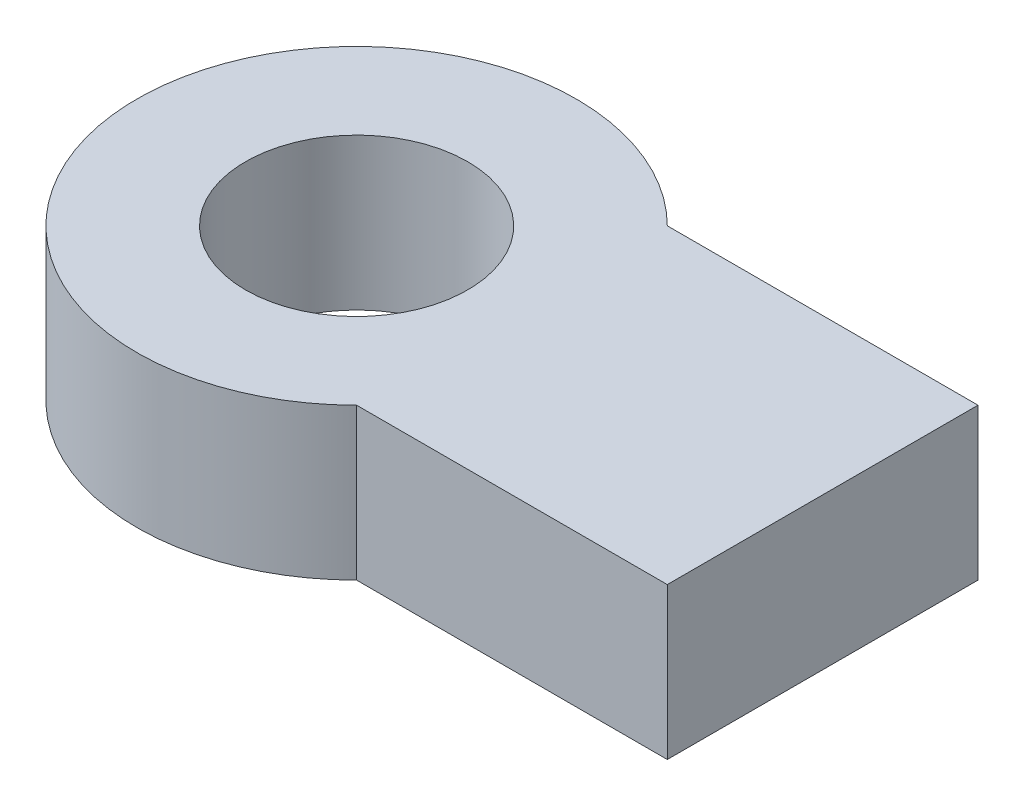
ISO-10303-21;
HEADER;
FILE_DESCRIPTION(('STEP AP214'),'2;1');
FILE_NAME('part.step','',(''),(''),'','','');
FILE_SCHEMA(('AUTOMOTIVE_DESIGN { 1 0 10303 214 1 1 1 1 }'));
ENDSEC;
DATA;
#1=APPLICATION_CONTEXT('core data for automotive mechanical design processes');
#2=APPLICATION_PROTOCOL_DEFINITION('international standard','automotive_design',2000,#1);
#3=PRODUCT_CONTEXT('',#1,'mechanical');
#4=PRODUCT('Part','Part','',(#3));
#5=PRODUCT_RELATED_PRODUCT_CATEGORY('part','',(#4));
#6=PRODUCT_DEFINITION_FORMATION('','',#4);
#7=PRODUCT_DEFINITION_CONTEXT('part definition',#1,'design');
#8=PRODUCT_DEFINITION('design','',#6,#7);
#9=PRODUCT_DEFINITION_SHAPE('','',#8);
#10=(LENGTH_UNIT() NAMED_UNIT(*) SI_UNIT(.MILLI.,.METRE.));
#11=(NAMED_UNIT(*) PLANE_ANGLE_UNIT() SI_UNIT($,.RADIAN.));
#12=(NAMED_UNIT(*) SI_UNIT($,.STERADIAN.) SOLID_ANGLE_UNIT());
#13=UNCERTAINTY_MEASURE_WITH_UNIT(LENGTH_MEASURE(1.E-05),#10,'distance_accuracy_value','');
#14=(GEOMETRIC_REPRESENTATION_CONTEXT(3) GLOBAL_UNCERTAINTY_ASSIGNED_CONTEXT((#13)) GLOBAL_UNIT_ASSIGNED_CONTEXT((#10,
#11,#12)) REPRESENTATION_CONTEXT('',''));
#15=CARTESIAN_POINT('',(0.,0.,0.));
#16=DIRECTION('',(0.,0.,1.));
#17=DIRECTION('',(1.,0.,0.));
#18=AXIS2_PLACEMENT_3D('',#15,#16,#17);
#19=CARTESIAN_POINT('',(0.,1.5,0.));
#20=DIRECTION('',(0.,1.,0.));
#21=DIRECTION('',(0.,0.,1.));
#22=AXIS2_PLACEMENT_3D('',#19,#20,#21);
#23=PLANE('',#22);
#24=CARTESIAN_POINT('',(0.,1.5,0.));
#25=DIRECTION('',(0.,1.,0.));
#26=DIRECTION('',(0.,0.,1.));
#27=AXIS2_PLACEMENT_3D('',#24,#25,#26);
#28=CIRCLE('',#27,2.175);
#29=CARTESIAN_POINT('',(1.53795724908074,1.5,-1.53795724908074));
#30=VERTEX_POINT('',#29);
#31=CARTESIAN_POINT('',(1.53795724908074,1.5,1.53795724908074));
#32=VERTEX_POINT('',#31);
#33=EDGE_CURVE('E92',#30,#32,#28,.T.);
#34=ORIENTED_EDGE('',*,*,#33,.T.);
#35=DIRECTION('',(1.,0.,0.));
#36=VECTOR('',#35,1.);
#37=CARTESIAN_POINT('',(1.53795724908074,1.5,1.53795724908074));
#38=LINE('',#37,#36);
#39=CARTESIAN_POINT('',(4.61387174724222,1.5,1.53795724908074));
#40=VERTEX_POINT('',#39);
#41=EDGE_CURVE('E87',#32,#40,#38,.T.);
#42=ORIENTED_EDGE('',*,*,#41,.T.);
#43=DIRECTION('',(0.,0.,-1.));
#44=VECTOR('',#43,1.);
#45=CARTESIAN_POINT('',(4.61387174724222,1.5,-1.53795724908074));
#46=LINE('',#45,#44);
#47=CARTESIAN_POINT('',(4.61387174724222,1.5,-1.53795724908074));
#48=VERTEX_POINT('',#47);
#49=EDGE_CURVE('E90',#40,#48,#46,.T.);
#50=ORIENTED_EDGE('',*,*,#49,.T.);
#51=DIRECTION('',(-1.,0.,0.));
#52=VECTOR('',#51,1.);
#53=CARTESIAN_POINT('',(1.53795724908074,1.5,-1.53795724908074));
#54=LINE('',#53,#52);
#55=EDGE_CURVE('E57',#48,#30,#54,.T.);
#56=ORIENTED_EDGE('',*,*,#55,.T.);
#57=EDGE_LOOP('',(#34,#42,#50,#56));
#58=FACE_BOUND('',#57,.T.);
#59=CARTESIAN_POINT('',(0.,1.5,0.));
#60=DIRECTION('',(0.,1.,0.));
#61=DIRECTION('',(0.,0.,1.));
#62=AXIS2_PLACEMENT_3D('',#59,#60,#61);
#63=CIRCLE('',#62,1.1);
#64=CARTESIAN_POINT('',(0.,1.5,1.1));
#65=VERTEX_POINT('',#64);
#66=EDGE_CURVE('E112',#65,#65,#63,.T.);
#67=ORIENTED_EDGE('',*,*,#66,.F.);
#68=EDGE_LOOP('',(#67));
#69=FACE_BOUND('',#68,.T.);
#70=ADVANCED_FACE('F39',(#58,#69),#23,.T.);
#71=CARTESIAN_POINT('',(0.,0.,0.));
#72=DIRECTION('',(0.,1.,0.));
#73=DIRECTION('',(0.,0.,1.));
#74=AXIS2_PLACEMENT_3D('',#71,#72,#73);
#75=PLANE('',#74);
#76=CARTESIAN_POINT('',(0.,0.,0.));
#77=DIRECTION('',(0.,1.,0.));
#78=DIRECTION('',(0.,0.,1.));
#79=AXIS2_PLACEMENT_3D('',#76,#77,#78);
#80=CIRCLE('',#79,2.175);
#81=CARTESIAN_POINT('',(1.53795724908074,0.,-1.53795724908074));
#82=VERTEX_POINT('',#81);
#83=CARTESIAN_POINT('',(1.53795724908074,0.,1.53795724908074));
#84=VERTEX_POINT('',#83);
#85=EDGE_CURVE('E108',#82,#84,#80,.T.);
#86=ORIENTED_EDGE('',*,*,#85,.F.);
#87=DIRECTION('',(-1.,0.,0.));
#88=VECTOR('',#87,1.);
#89=CARTESIAN_POINT('',(1.53795724908074,0.,-1.53795724908074));
#90=LINE('',#89,#88);
#91=CARTESIAN_POINT('',(4.61387174724222,0.,-1.53795724908074));
#92=VERTEX_POINT('',#91);
#93=EDGE_CURVE('E80',#92,#82,#90,.T.);
#94=ORIENTED_EDGE('',*,*,#93,.F.);
#95=DIRECTION('',(0.,0.,-1.));
#96=VECTOR('',#95,1.);
#97=CARTESIAN_POINT('',(4.61387174724222,0.,-1.53795724908074));
#98=LINE('',#97,#96);
#99=CARTESIAN_POINT('',(4.61387174724222,0.,1.53795724908074));
#100=VERTEX_POINT('',#99);
#101=EDGE_CURVE('E74',#100,#92,#98,.T.);
#102=ORIENTED_EDGE('',*,*,#101,.F.);
#103=DIRECTION('',(1.,0.,0.));
#104=VECTOR('',#103,1.);
#105=CARTESIAN_POINT('',(1.53795724908074,0.,1.53795724908074));
#106=LINE('',#105,#104);
#107=EDGE_CURVE('E97',#84,#100,#106,.T.);
#108=ORIENTED_EDGE('',*,*,#107,.F.);
#109=EDGE_LOOP('',(#86,#94,#102,#108));
#110=FACE_BOUND('',#109,.T.);
#111=CARTESIAN_POINT('',(0.,0.,0.));
#112=DIRECTION('',(0.,1.,0.));
#113=DIRECTION('',(0.,0.,1.));
#114=AXIS2_PLACEMENT_3D('',#111,#112,#113);
#115=CIRCLE('',#114,1.1);
#116=CARTESIAN_POINT('',(0.,0.,1.1));
#117=VERTEX_POINT('',#116);
#118=EDGE_CURVE('E130',#117,#117,#115,.T.);
#119=ORIENTED_EDGE('',*,*,#118,.T.);
#120=EDGE_LOOP('',(#119));
#121=FACE_BOUND('',#120,.T.);
#122=ADVANCED_FACE('F125',(#110,#121),#75,.F.);
#123=CARTESIAN_POINT('',(0.,1.5,0.));
#124=DIRECTION('',(0.,-1.,0.));
#125=DIRECTION('',(0.,0.,-1.));
#126=AXIS2_PLACEMENT_3D('',#123,#124,#125);
#127=CYLINDRICAL_SURFACE('',#126,2.175);
#128=ORIENTED_EDGE('',*,*,#85,.T.);
#129=DIRECTION('',(0.,-1.,0.));
#130=VECTOR('',#129,1.);
#131=CARTESIAN_POINT('',(1.53795724908074,1.5,1.53795724908074));
#132=LINE('',#131,#130);
#133=EDGE_CURVE('E11',#32,#84,#132,.T.);
#134=ORIENTED_EDGE('',*,*,#133,.F.);
#135=ORIENTED_EDGE('',*,*,#33,.F.);
#136=DIRECTION('',(0.,-1.,0.));
#137=VECTOR('',#136,1.);
#138=CARTESIAN_POINT('',(1.53795724908074,1.5,-1.53795724908074));
#139=LINE('',#138,#137);
#140=EDGE_CURVE('E104',#30,#82,#139,.T.);
#141=ORIENTED_EDGE('',*,*,#140,.T.);
#142=EDGE_LOOP('',(#128,#134,#135,#141));
#143=FACE_BOUND('',#142,.T.);
#144=ADVANCED_FACE('F41',(#143),#127,.T.);
#145=CARTESIAN_POINT('',(1.53795724908074,1.5,1.53795724908074));
#146=DIRECTION('',(0.,0.,-1.));
#147=DIRECTION('',(-1.,0.,0.));
#148=AXIS2_PLACEMENT_3D('',#145,#146,#147);
#149=PLANE('',#148);
#150=ORIENTED_EDGE('',*,*,#107,.T.);
#151=DIRECTION('',(0.,-1.,0.));
#152=VECTOR('',#151,1.);
#153=CARTESIAN_POINT('',(4.61387174724222,1.5,1.53795724908074));
#154=LINE('',#153,#152);
#155=EDGE_CURVE('E49',#40,#100,#154,.T.);
#156=ORIENTED_EDGE('',*,*,#155,.F.);
#157=ORIENTED_EDGE('',*,*,#41,.F.);
#158=ORIENTED_EDGE('',*,*,#133,.T.);
#159=EDGE_LOOP('',(#150,#156,#157,#158));
#160=FACE_BOUND('',#159,.T.);
#161=ADVANCED_FACE('F96',(#160),#149,.F.);
#162=CARTESIAN_POINT('',(4.61387174724222,1.5,-1.53795724908074));
#163=DIRECTION('',(-1.,0.,0.));
#164=DIRECTION('',(0.,0.,1.));
#165=AXIS2_PLACEMENT_3D('',#162,#163,#164);
#166=PLANE('',#165);
#167=ORIENTED_EDGE('',*,*,#101,.T.);
#168=DIRECTION('',(0.,-1.,0.));
#169=VECTOR('',#168,1.);
#170=CARTESIAN_POINT('',(4.61387174724222,1.5,-1.53795724908074));
#171=LINE('',#170,#169);
#172=EDGE_CURVE('E99',#48,#92,#171,.T.);
#173=ORIENTED_EDGE('',*,*,#172,.F.);
#174=ORIENTED_EDGE('',*,*,#49,.F.);
#175=ORIENTED_EDGE('',*,*,#155,.T.);
#176=EDGE_LOOP('',(#167,#173,#174,#175));
#177=FACE_BOUND('',#176,.T.);
#178=ADVANCED_FACE('F100',(#177),#166,.F.);
#179=CARTESIAN_POINT('',(1.53795724908074,1.5,-1.53795724908074));
#180=DIRECTION('',(0.,0.,1.));
#181=DIRECTION('',(1.,0.,0.));
#182=AXIS2_PLACEMENT_3D('',#179,#180,#181);
#183=PLANE('',#182);
#184=ORIENTED_EDGE('',*,*,#93,.T.);
#185=ORIENTED_EDGE('',*,*,#140,.F.);
#186=ORIENTED_EDGE('',*,*,#55,.F.);
#187=ORIENTED_EDGE('',*,*,#172,.T.);
#188=EDGE_LOOP('',(#184,#185,#186,#187));
#189=FACE_BOUND('',#188,.T.);
#190=ADVANCED_FACE('F122',(#189),#183,.F.);
#191=CARTESIAN_POINT('',(0.,1.5,0.));
#192=DIRECTION('',(0.,-1.,0.));
#193=DIRECTION('',(0.,0.,-1.));
#194=AXIS2_PLACEMENT_3D('',#191,#192,#193);
#195=CYLINDRICAL_SURFACE('',#194,1.1);
#196=ORIENTED_EDGE('',*,*,#66,.T.);
#197=EDGE_LOOP('',(#196));
#198=FACE_BOUND('',#197,.T.);
#199=ORIENTED_EDGE('',*,*,#118,.F.);
#200=EDGE_LOOP('',(#199));
#201=FACE_BOUND('',#200,.T.);
#202=ADVANCED_FACE('F138',(#198,#201),#195,.F.);
#203=CLOSED_SHELL('',(#70,#122,#144,#161,#178,#190,#202));
#204=MANIFOLD_SOLID_BREP('B2',#203);
#205=ADVANCED_BREP_SHAPE_REPRESENTATION('',(#18,#204),#14);
#206=SHAPE_DEFINITION_REPRESENTATION(#9,#205);
ENDSEC;
END-ISO-10303-21;
